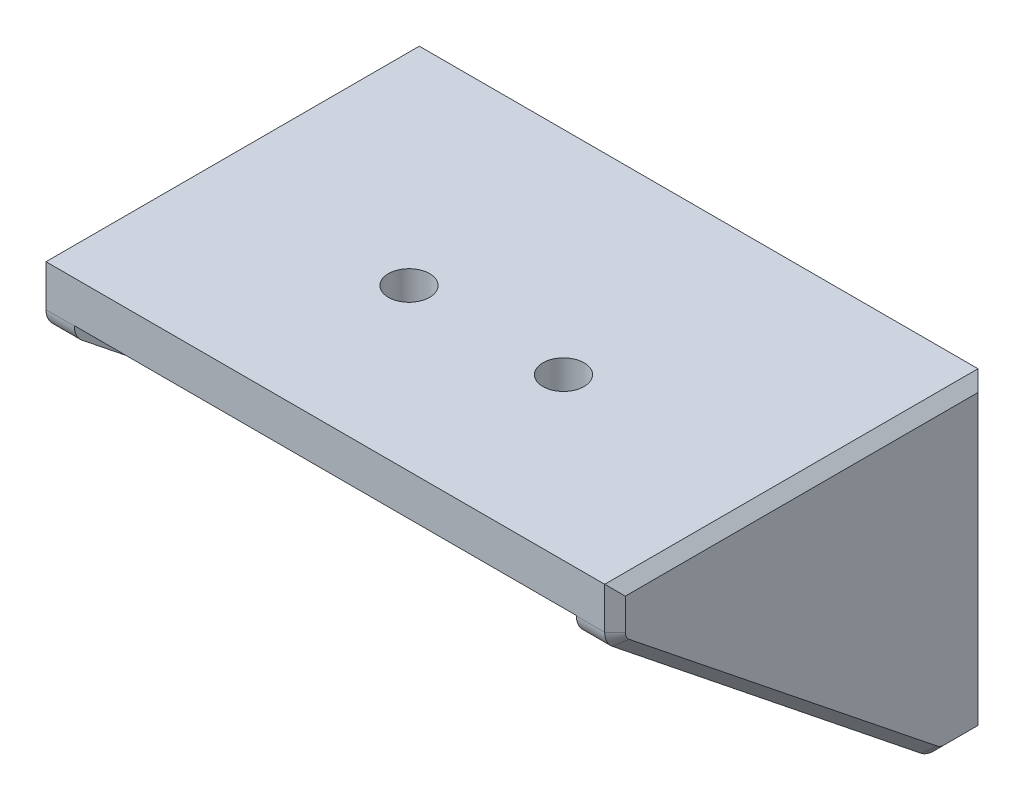
ISO-10303-21;
HEADER;
FILE_DESCRIPTION(('STEP AP214'),'2;1');
FILE_NAME('part.step','',(''),(''),'','','');
FILE_SCHEMA(('AUTOMOTIVE_DESIGN { 1 0 10303 214 1 1 1 1 }'));
ENDSEC;
DATA;
#1=APPLICATION_CONTEXT('core data for automotive mechanical design processes');
#2=APPLICATION_PROTOCOL_DEFINITION('international standard','automotive_design',2000,#1);
#3=PRODUCT_CONTEXT('',#1,'mechanical');
#4=PRODUCT('Part','Part','',(#3));
#5=PRODUCT_RELATED_PRODUCT_CATEGORY('part','',(#4));
#6=PRODUCT_DEFINITION_FORMATION('','',#4);
#7=PRODUCT_DEFINITION_CONTEXT('part definition',#1,'design');
#8=PRODUCT_DEFINITION('design','',#6,#7);
#9=PRODUCT_DEFINITION_SHAPE('','',#8);
#10=(LENGTH_UNIT() NAMED_UNIT(*) SI_UNIT(.MILLI.,.METRE.));
#11=(NAMED_UNIT(*) PLANE_ANGLE_UNIT() SI_UNIT($,.RADIAN.));
#12=(NAMED_UNIT(*) SI_UNIT($,.STERADIAN.) SOLID_ANGLE_UNIT());
#13=UNCERTAINTY_MEASURE_WITH_UNIT(LENGTH_MEASURE(1.E-05),#10,'distance_accuracy_value','');
#14=(GEOMETRIC_REPRESENTATION_CONTEXT(3) GLOBAL_UNCERTAINTY_ASSIGNED_CONTEXT((#13)) GLOBAL_UNIT_ASSIGNED_CONTEXT((#10,
#11,#12)) REPRESENTATION_CONTEXT('',''));
#15=CARTESIAN_POINT('',(0.,0.,0.));
#16=DIRECTION('',(0.,0.,1.));
#17=DIRECTION('',(1.,0.,0.));
#18=AXIS2_PLACEMENT_3D('',#15,#16,#17);
#19=CARTESIAN_POINT('',(0.,4.,0.));
#20=DIRECTION('',(0.,-1.,0.));
#21=DIRECTION('',(0.,0.,-1.));
#22=AXIS2_PLACEMENT_3D('',#19,#20,#21);
#23=PLANE('',#22);
#24=DIRECTION('',(-1.,0.,0.));
#25=VECTOR('',#24,1.);
#26=CARTESIAN_POINT('',(-19.5,4.,-14.5));
#27=LINE('',#26,#25);
#28=CARTESIAN_POINT('',(21.7,4.,-14.5));
#29=VERTEX_POINT('',#28);
#30=CARTESIAN_POINT('',(-21.7,4.,-14.5));
#31=VERTEX_POINT('',#30);
#32=EDGE_CURVE('E229',#29,#31,#27,.T.);
#33=ORIENTED_EDGE('',*,*,#32,.T.);
#34=DIRECTION('',(0.,0.,1.));
#35=VECTOR('',#34,1.);
#36=CARTESIAN_POINT('',(-21.7,4.,14.5));
#37=LINE('',#36,#35);
#38=CARTESIAN_POINT('',(-21.7,4.,14.5));
#39=VERTEX_POINT('',#38);
#40=EDGE_CURVE('E285',#31,#39,#37,.T.);
#41=ORIENTED_EDGE('',*,*,#40,.T.);
#42=DIRECTION('',(1.,0.,0.));
#43=VECTOR('',#42,1.);
#44=CARTESIAN_POINT('',(-19.5,4.,14.5));
#45=LINE('',#44,#43);
#46=CARTESIAN_POINT('',(21.7,4.,14.5));
#47=VERTEX_POINT('',#46);
#48=EDGE_CURVE('E257',#39,#47,#45,.T.);
#49=ORIENTED_EDGE('',*,*,#48,.T.);
#50=DIRECTION('',(0.,0.,-1.));
#51=VECTOR('',#50,1.);
#52=CARTESIAN_POINT('',(21.7,4.,-14.5));
#53=LINE('',#52,#51);
#54=EDGE_CURVE('E283',#47,#29,#53,.T.);
#55=ORIENTED_EDGE('',*,*,#54,.T.);
#56=EDGE_LOOP('',(#33,#41,#49,#55));
#57=FACE_BOUND('',#56,.T.);
#58=CARTESIAN_POINT('',(-6.,4.,2.));
#59=DIRECTION('',(0.,1.,0.));
#60=DIRECTION('',(0.,0.,1.));
#61=AXIS2_PLACEMENT_3D('',#58,#59,#60);
#62=CIRCLE('',#61,1.6);
#63=CARTESIAN_POINT('',(-6.,4.,3.6));
#64=VERTEX_POINT('',#63);
#65=EDGE_CURVE('E250',#64,#64,#62,.T.);
#66=ORIENTED_EDGE('',*,*,#65,.F.);
#67=EDGE_LOOP('',(#66));
#68=FACE_BOUND('',#67,.T.);
#69=CARTESIAN_POINT('',(6.,4.,2.));
#70=DIRECTION('',(0.,1.,0.));
#71=DIRECTION('',(0.,0.,-1.));
#72=AXIS2_PLACEMENT_3D('',#69,#70,#71);
#73=CIRCLE('',#72,1.6);
#74=CARTESIAN_POINT('',(6.,4.,0.400000000000002));
#75=VERTEX_POINT('',#74);
#76=EDGE_CURVE('E244',#75,#75,#73,.T.);
#77=ORIENTED_EDGE('',*,*,#76,.F.);
#78=EDGE_LOOP('',(#77));
#79=FACE_BOUND('',#78,.T.);
#80=ADVANCED_FACE('F37',(#57,#68,#79),#23,.F.);
#81=CARTESIAN_POINT('',(0.,0.,0.));
#82=DIRECTION('',(0.,-1.,0.));
#83=DIRECTION('',(0.,0.,-1.));
#84=AXIS2_PLACEMENT_3D('',#81,#82,#83);
#85=PLANE('',#84);
#86=DIRECTION('',(0.,0.,-1.));
#87=VECTOR('',#86,1.);
#88=CARTESIAN_POINT('',(19.5,0.,14.5));
#89=LINE('',#88,#87);
#90=CARTESIAN_POINT('',(19.5,0.,13.7));
#91=VERTEX_POINT('',#90);
#92=CARTESIAN_POINT('',(19.5,0.,-10.5));
#93=VERTEX_POINT('',#92);
#94=EDGE_CURVE('E230',#91,#93,#89,.T.);
#95=ORIENTED_EDGE('',*,*,#94,.F.);
#96=DIRECTION('',(-1.,0.,0.));
#97=VECTOR('',#96,1.);
#98=CARTESIAN_POINT('',(-19.5,0.,13.7));
#99=LINE('',#98,#97);
#100=CARTESIAN_POINT('',(-19.5,0.,13.7));
#101=VERTEX_POINT('',#100);
#102=EDGE_CURVE('E228',#91,#101,#99,.T.);
#103=ORIENTED_EDGE('',*,*,#102,.T.);
#104=DIRECTION('',(0.,0.,1.));
#105=VECTOR('',#104,1.);
#106=CARTESIAN_POINT('',(-19.5,0.,14.5));
#107=LINE('',#106,#105);
#108=CARTESIAN_POINT('',(-19.5,0.,-10.5));
#109=VERTEX_POINT('',#108);
#110=EDGE_CURVE('E212',#109,#101,#107,.T.);
#111=ORIENTED_EDGE('',*,*,#110,.F.);
#112=DIRECTION('',(-1.,0.,0.));
#113=VECTOR('',#112,1.);
#114=CARTESIAN_POINT('',(19.5,0.,-10.5));
#115=LINE('',#114,#113);
#116=EDGE_CURVE('E220',#93,#109,#115,.T.);
#117=ORIENTED_EDGE('',*,*,#116,.F.);
#118=EDGE_LOOP('',(#95,#103,#111,#117));
#119=FACE_BOUND('',#118,.T.);
#120=CARTESIAN_POINT('',(-6.,0.,2.));
#121=DIRECTION('',(0.,1.,0.));
#122=DIRECTION('',(0.,0.,1.));
#123=AXIS2_PLACEMENT_3D('',#120,#121,#122);
#124=CIRCLE('',#123,1.6);
#125=CARTESIAN_POINT('',(-6.,0.,3.6));
#126=VERTEX_POINT('',#125);
#127=EDGE_CURVE('E247',#126,#126,#124,.T.);
#128=ORIENTED_EDGE('',*,*,#127,.T.);
#129=EDGE_LOOP('',(#128));
#130=FACE_BOUND('',#129,.T.);
#131=CARTESIAN_POINT('',(6.,0.,2.));
#132=DIRECTION('',(0.,1.,0.));
#133=DIRECTION('',(0.,0.,-1.));
#134=AXIS2_PLACEMENT_3D('',#131,#132,#133);
#135=CIRCLE('',#134,1.6);
#136=CARTESIAN_POINT('',(6.,0.,0.400000000000002));
#137=VERTEX_POINT('',#136);
#138=EDGE_CURVE('E243',#137,#137,#135,.T.);
#139=ORIENTED_EDGE('',*,*,#138,.T.);
#140=EDGE_LOOP('',(#139));
#141=FACE_BOUND('',#140,.T.);
#142=ADVANCED_FACE('F225',(#119,#130,#141),#85,.T.);
#143=CARTESIAN_POINT('',(-19.5,4.,-14.5));
#144=DIRECTION('',(0.,0.,1.));
#145=DIRECTION('',(1.,0.,0.));
#146=AXIS2_PLACEMENT_3D('',#143,#144,#145);
#147=PLANE('',#146);
#148=CARTESIAN_POINT('',(-16.,-4.00000000000001,-14.5));
#149=DIRECTION('',(0.,0.,1.));
#150=DIRECTION('',(-1.,0.,0.));
#151=AXIS2_PLACEMENT_3D('',#148,#149,#150);
#152=CIRCLE('',#151,1.35);
#153=CARTESIAN_POINT('',(-17.35,-4.00000000000001,-14.5));
#154=VERTEX_POINT('',#153);
#155=EDGE_CURVE('E926',#154,#154,#152,.T.);
#156=ORIENTED_EDGE('',*,*,#155,.T.);
#157=EDGE_LOOP('',(#156));
#158=FACE_BOUND('',#157,.T.);
#159=CARTESIAN_POINT('',(-16.,-16.,-14.5));
#160=DIRECTION('',(0.,0.,1.));
#161=DIRECTION('',(1.,0.,0.));
#162=AXIS2_PLACEMENT_3D('',#159,#160,#161);
#163=CIRCLE('',#162,1.35);
#164=CARTESIAN_POINT('',(-14.65,-16.,-14.5));
#165=VERTEX_POINT('',#164);
#166=EDGE_CURVE('E915',#165,#165,#163,.T.);
#167=ORIENTED_EDGE('',*,*,#166,.T.);
#168=EDGE_LOOP('',(#167));
#169=FACE_BOUND('',#168,.T.);
#170=CARTESIAN_POINT('',(16.,-16.,-14.5));
#171=DIRECTION('',(0.,0.,1.));
#172=DIRECTION('',(-1.,0.,0.));
#173=AXIS2_PLACEMENT_3D('',#170,#171,#172);
#174=CIRCLE('',#173,1.35);
#175=CARTESIAN_POINT('',(14.65,-16.,-14.5));
#176=VERTEX_POINT('',#175);
#177=EDGE_CURVE('E908',#176,#176,#174,.T.);
#178=ORIENTED_EDGE('',*,*,#177,.T.);
#179=EDGE_LOOP('',(#178));
#180=FACE_BOUND('',#179,.T.);
#181=CARTESIAN_POINT('',(16.,-4.,-14.5));
#182=DIRECTION('',(0.,0.,1.));
#183=DIRECTION('',(1.,0.,0.));
#184=AXIS2_PLACEMENT_3D('',#181,#182,#183);
#185=CIRCLE('',#184,1.35);
#186=CARTESIAN_POINT('',(17.35,-4.,-14.5));
#187=VERTEX_POINT('',#186);
#188=EDGE_CURVE('E235',#187,#187,#185,.T.);
#189=ORIENTED_EDGE('',*,*,#188,.T.);
#190=EDGE_LOOP('',(#189));
#191=FACE_BOUND('',#190,.T.);
#192=DIRECTION('',(-1.,0.,0.));
#193=VECTOR('',#192,1.);
#194=CARTESIAN_POINT('',(-19.5,-19.2,-14.5));
#195=LINE('',#194,#193);
#196=CARTESIAN_POINT('',(21.7,-19.2,-14.5));
#197=VERTEX_POINT('',#196);
#198=CARTESIAN_POINT('',(-21.7,-19.2,-14.5));
#199=VERTEX_POINT('',#198);
#200=EDGE_CURVE('E295',#197,#199,#195,.T.);
#201=ORIENTED_EDGE('',*,*,#200,.T.);
#202=DIRECTION('',(0.,1.,0.));
#203=VECTOR('',#202,1.);
#204=CARTESIAN_POINT('',(-21.7,4.,-14.5));
#205=LINE('',#204,#203);
#206=EDGE_CURVE('E297',#199,#31,#205,.T.);
#207=ORIENTED_EDGE('',*,*,#206,.T.);
#208=ORIENTED_EDGE('',*,*,#32,.F.);
#209=DIRECTION('',(0.,-1.,0.));
#210=VECTOR('',#209,1.);
#211=CARTESIAN_POINT('',(21.7,-20.,-14.5));
#212=LINE('',#211,#210);
#213=EDGE_CURVE('E293',#29,#197,#212,.T.);
#214=ORIENTED_EDGE('',*,*,#213,.T.);
#215=EDGE_LOOP('',(#201,#207,#208,#214));
#216=FACE_BOUND('',#215,.T.);
#217=ADVANCED_FACE('F469',(#158,#169,#180,#191,#216),#147,.F.);
#218=CARTESIAN_POINT('',(-19.5,4.,14.5));
#219=DIRECTION('',(0.,0.,-1.));
#220=DIRECTION('',(-1.,0.,0.));
#221=AXIS2_PLACEMENT_3D('',#218,#219,#220);
#222=PLANE('',#221);
#223=DIRECTION('',(-1.,0.,0.));
#224=VECTOR('',#223,1.);
#225=CARTESIAN_POINT('',(-19.5,0.768999755978511,14.5));
#226=LINE('',#225,#224);
#227=CARTESIAN_POINT('',(19.5,0.768999755978511,14.5));
#228=VERTEX_POINT('',#227);
#229=CARTESIAN_POINT('',(21.7,0.768999755978511,14.5));
#230=VERTEX_POINT('',#229);
#231=EDGE_CURVE('E312',#228,#230,#226,.F.);
#232=ORIENTED_EDGE('',*,*,#231,.T.);
#233=DIRECTION('',(0.,1.,0.));
#234=VECTOR('',#233,1.);
#235=CARTESIAN_POINT('',(21.7,3.20000000000001,14.5));
#236=LINE('',#235,#234);
#237=EDGE_CURVE('E366',#230,#47,#236,.T.);
#238=ORIENTED_EDGE('',*,*,#237,.T.);
#239=ORIENTED_EDGE('',*,*,#48,.F.);
#240=DIRECTION('',(0.,-1.,0.));
#241=VECTOR('',#240,1.);
#242=CARTESIAN_POINT('',(-21.7,0.768999755978511,14.5));
#243=LINE('',#242,#241);
#244=CARTESIAN_POINT('',(-21.7,0.768999755978511,14.5));
#245=VERTEX_POINT('',#244);
#246=EDGE_CURVE('E364',#39,#245,#243,.T.);
#247=ORIENTED_EDGE('',*,*,#246,.T.);
#248=DIRECTION('',(1.,0.,0.));
#249=VECTOR('',#248,1.);
#250=CARTESIAN_POINT('',(-19.5,0.768999755978511,14.5));
#251=LINE('',#250,#249);
#252=CARTESIAN_POINT('',(-19.5,0.768999755978511,14.5));
#253=VERTEX_POINT('',#252);
#254=EDGE_CURVE('E329',#245,#253,#251,.T.);
#255=ORIENTED_EDGE('',*,*,#254,.T.);
#256=DIRECTION('',(0.,1.,0.));
#257=VECTOR('',#256,1.);
#258=CARTESIAN_POINT('',(-19.5,4.,14.5));
#259=LINE('',#258,#257);
#260=CARTESIAN_POINT('',(-19.5,0.799999999999995,14.5));
#261=VERTEX_POINT('',#260);
#262=EDGE_CURVE('E260',#253,#261,#259,.T.);
#263=ORIENTED_EDGE('',*,*,#262,.T.);
#264=DIRECTION('',(1.,0.,0.));
#265=VECTOR('',#264,1.);
#266=CARTESIAN_POINT('',(19.5,0.799999999999995,14.5));
#267=LINE('',#266,#265);
#268=CARTESIAN_POINT('',(19.5,0.799999999999995,14.5));
#269=VERTEX_POINT('',#268);
#270=EDGE_CURVE('E263',#261,#269,#267,.T.);
#271=ORIENTED_EDGE('',*,*,#270,.T.);
#272=DIRECTION('',(0.,-1.,0.));
#273=VECTOR('',#272,1.);
#274=CARTESIAN_POINT('',(19.5,4.,14.5));
#275=LINE('',#274,#273);
#276=EDGE_CURVE('E266',#269,#228,#275,.T.);
#277=ORIENTED_EDGE('',*,*,#276,.T.);
#278=EDGE_LOOP('',(#232,#238,#239,#247,#255,#263,#271,#277));
#279=FACE_BOUND('',#278,.T.);
#280=ADVANCED_FACE('F476',(#279),#222,.F.);
#281=CARTESIAN_POINT('',(-6.,4.,2.));
#282=DIRECTION('',(0.,-1.,0.));
#283=DIRECTION('',(0.,0.,-1.));
#284=AXIS2_PLACEMENT_3D('',#281,#282,#283);
#285=CYLINDRICAL_SURFACE('',#284,1.6);
#286=ORIENTED_EDGE('',*,*,#65,.T.);
#287=EDGE_LOOP('',(#286));
#288=FACE_BOUND('',#287,.T.);
#289=ORIENTED_EDGE('',*,*,#127,.F.);
#290=EDGE_LOOP('',(#289));
#291=FACE_BOUND('',#290,.T.);
#292=ADVANCED_FACE('F473',(#288,#291),#285,.F.);
#293=CARTESIAN_POINT('',(6.,4.,2.));
#294=DIRECTION('',(0.,-1.,0.));
#295=DIRECTION('',(0.,0.,-1.));
#296=AXIS2_PLACEMENT_3D('',#293,#294,#295);
#297=CYLINDRICAL_SURFACE('',#296,1.6);
#298=ORIENTED_EDGE('',*,*,#76,.T.);
#299=EDGE_LOOP('',(#298));
#300=FACE_BOUND('',#299,.T.);
#301=ORIENTED_EDGE('',*,*,#138,.F.);
#302=EDGE_LOOP('',(#301));
#303=FACE_BOUND('',#302,.T.);
#304=ADVANCED_FACE('F804',(#300,#303),#297,.F.);
#305=CARTESIAN_POINT('',(19.5,-20.,-10.5));
#306=DIRECTION('',(0.,0.,-1.));
#307=DIRECTION('',(-1.,0.,0.));
#308=AXIS2_PLACEMENT_3D('',#305,#306,#307);
#309=PLANE('',#308);
#310=CARTESIAN_POINT('',(-16.,-4.00000000000001,-10.5));
#311=DIRECTION('',(0.,0.,1.));
#312=DIRECTION('',(-1.,0.,0.));
#313=AXIS2_PLACEMENT_3D('',#310,#311,#312);
#314=CIRCLE('',#313,1.35);
#315=CARTESIAN_POINT('',(-17.35,-4.00000000000001,-10.5));
#316=VERTEX_POINT('',#315);
#317=EDGE_CURVE('E929',#316,#316,#314,.T.);
#318=ORIENTED_EDGE('',*,*,#317,.F.);
#319=EDGE_LOOP('',(#318));
#320=FACE_BOUND('',#319,.T.);
#321=CARTESIAN_POINT('',(-16.,-16.,-10.5));
#322=DIRECTION('',(0.,0.,1.));
#323=DIRECTION('',(1.,0.,0.));
#324=AXIS2_PLACEMENT_3D('',#321,#322,#323);
#325=CIRCLE('',#324,1.35);
#326=CARTESIAN_POINT('',(-14.65,-16.,-10.5));
#327=VERTEX_POINT('',#326);
#328=EDGE_CURVE('E923',#327,#327,#325,.T.);
#329=ORIENTED_EDGE('',*,*,#328,.F.);
#330=EDGE_LOOP('',(#329));
#331=FACE_BOUND('',#330,.T.);
#332=CARTESIAN_POINT('',(16.,-16.,-10.5));
#333=DIRECTION('',(0.,0.,1.));
#334=DIRECTION('',(-1.,0.,0.));
#335=AXIS2_PLACEMENT_3D('',#332,#333,#334);
#336=CIRCLE('',#335,1.35);
#337=CARTESIAN_POINT('',(14.65,-16.,-10.5));
#338=VERTEX_POINT('',#337);
#339=EDGE_CURVE('E910',#338,#338,#336,.T.);
#340=ORIENTED_EDGE('',*,*,#339,.F.);
#341=EDGE_LOOP('',(#340));
#342=FACE_BOUND('',#341,.T.);
#343=CARTESIAN_POINT('',(16.,-4.,-10.5));
#344=DIRECTION('',(0.,0.,1.));
#345=DIRECTION('',(1.,0.,0.));
#346=AXIS2_PLACEMENT_3D('',#343,#344,#345);
#347=CIRCLE('',#346,1.35);
#348=CARTESIAN_POINT('',(17.35,-4.,-10.5));
#349=VERTEX_POINT('',#348);
#350=EDGE_CURVE('E238',#349,#349,#347,.T.);
#351=ORIENTED_EDGE('',*,*,#350,.F.);
#352=EDGE_LOOP('',(#351));
#353=FACE_BOUND('',#352,.T.);
#354=DIRECTION('',(0.,1.,0.));
#355=VECTOR('',#354,1.);
#356=CARTESIAN_POINT('',(-19.5,-20.,-10.5));
#357=LINE('',#356,#355);
#358=CARTESIAN_POINT('',(-19.5,-19.2,-10.5));
#359=VERTEX_POINT('',#358);
#360=EDGE_CURVE('E207',#359,#109,#357,.T.);
#361=ORIENTED_EDGE('',*,*,#360,.F.);
#362=DIRECTION('',(1.,0.,0.));
#363=VECTOR('',#362,1.);
#364=CARTESIAN_POINT('',(19.5,-19.2,-10.5));
#365=LINE('',#364,#363);
#366=CARTESIAN_POINT('',(19.5,-19.2,-10.5));
#367=VERTEX_POINT('',#366);
#368=EDGE_CURVE('E281',#359,#367,#365,.T.);
#369=ORIENTED_EDGE('',*,*,#368,.T.);
#370=DIRECTION('',(0.,1.,0.));
#371=VECTOR('',#370,1.);
#372=CARTESIAN_POINT('',(19.5,-20.,-10.5));
#373=LINE('',#372,#371);
#374=EDGE_CURVE('E219',#367,#93,#373,.T.);
#375=ORIENTED_EDGE('',*,*,#374,.T.);
#376=ORIENTED_EDGE('',*,*,#116,.T.);
#377=EDGE_LOOP('',(#361,#369,#375,#376));
#378=FACE_BOUND('',#377,.T.);
#379=ADVANCED_FACE('F232',(#320,#331,#342,#353,#378),#309,.F.);
#380=CARTESIAN_POINT('',(0.,-20.,0.));
#381=DIRECTION('',(0.,1.,0.));
#382=DIRECTION('',(0.,0.,1.));
#383=AXIS2_PLACEMENT_3D('',#380,#381,#382);
#384=PLANE('',#383);
#385=DIRECTION('',(1.,0.,0.));
#386=VECTOR('',#385,1.);
#387=CARTESIAN_POINT('',(0.,-20.,-13.7));
#388=LINE('',#387,#386);
#389=CARTESIAN_POINT('',(-21.7,-20.,-13.7));
#390=VERTEX_POINT('',#389);
#391=CARTESIAN_POINT('',(21.7,-20.,-13.7));
#392=VERTEX_POINT('',#391);
#393=EDGE_CURVE('E270',#390,#392,#388,.T.);
#394=ORIENTED_EDGE('',*,*,#393,.T.);
#395=DIRECTION('',(0.,0.,1.));
#396=VECTOR('',#395,1.);
#397=CARTESIAN_POINT('',(21.7,-20.,-11.0612496949731));
#398=LINE('',#397,#396);
#399=CARTESIAN_POINT('',(21.7,-20.,-11.0612496949731));
#400=VERTEX_POINT('',#399);
#401=EDGE_CURVE('E379',#392,#400,#398,.T.);
#402=ORIENTED_EDGE('',*,*,#401,.T.);
#403=DIRECTION('',(-1.,0.,0.));
#404=VECTOR('',#403,1.);
#405=CARTESIAN_POINT('',(0.,-20.,-11.0612496949731));
#406=LINE('',#405,#404);
#407=CARTESIAN_POINT('',(19.5,-20.,-11.0612496949731));
#408=VERTEX_POINT('',#407);
#409=EDGE_CURVE('E339',#400,#408,#406,.T.);
#410=ORIENTED_EDGE('',*,*,#409,.T.);
#411=DIRECTION('',(0.,0.,-1.));
#412=VECTOR('',#411,1.);
#413=CARTESIAN_POINT('',(19.5,-20.,0.));
#414=LINE('',#413,#412);
#415=CARTESIAN_POINT('',(19.5,-20.,-11.3));
#416=VERTEX_POINT('',#415);
#417=EDGE_CURVE('E273',#408,#416,#414,.T.);
#418=ORIENTED_EDGE('',*,*,#417,.T.);
#419=DIRECTION('',(-1.,0.,0.));
#420=VECTOR('',#419,1.);
#421=CARTESIAN_POINT('',(0.,-20.,-11.3));
#422=LINE('',#421,#420);
#423=CARTESIAN_POINT('',(-19.5,-20.,-11.3));
#424=VERTEX_POINT('',#423);
#425=EDGE_CURVE('E275',#416,#424,#422,.T.);
#426=ORIENTED_EDGE('',*,*,#425,.T.);
#427=DIRECTION('',(0.,0.,1.));
#428=VECTOR('',#427,1.);
#429=CARTESIAN_POINT('',(-19.5,-20.,0.));
#430=LINE('',#429,#428);
#431=CARTESIAN_POINT('',(-19.5,-20.,-11.0612496949731));
#432=VERTEX_POINT('',#431);
#433=EDGE_CURVE('E278',#424,#432,#430,.T.);
#434=ORIENTED_EDGE('',*,*,#433,.T.);
#435=DIRECTION('',(1.,0.,0.));
#436=VECTOR('',#435,1.);
#437=CARTESIAN_POINT('',(-22.5,-20.,-11.0612496949731));
#438=LINE('',#437,#436);
#439=CARTESIAN_POINT('',(-21.7,-20.,-11.0612496949731));
#440=VERTEX_POINT('',#439);
#441=EDGE_CURVE('E341',#432,#440,#438,.F.);
#442=ORIENTED_EDGE('',*,*,#441,.T.);
#443=DIRECTION('',(0.,0.,-1.));
#444=VECTOR('',#443,1.);
#445=CARTESIAN_POINT('',(-21.7,-20.,-13.7));
#446=LINE('',#445,#444);
#447=EDGE_CURVE('E376',#440,#390,#446,.T.);
#448=ORIENTED_EDGE('',*,*,#447,.T.);
#449=EDGE_LOOP('',(#394,#402,#410,#418,#426,#434,#442,#448));
#450=FACE_BOUND('',#449,.T.);
#451=ADVANCED_FACE('F749',(#450),#384,.F.);
#452=CARTESIAN_POINT('',(16.,-4.,-14.5));
#453=DIRECTION('',(0.,0.,1.));
#454=DIRECTION('',(1.,0.,0.));
#455=AXIS2_PLACEMENT_3D('',#452,#453,#454);
#456=CYLINDRICAL_SURFACE('',#455,1.35);
#457=ORIENTED_EDGE('',*,*,#188,.F.);
#458=EDGE_LOOP('',(#457));
#459=FACE_BOUND('',#458,.T.);
#460=ORIENTED_EDGE('',*,*,#350,.T.);
#461=EDGE_LOOP('',(#460));
#462=FACE_BOUND('',#461,.T.);
#463=ADVANCED_FACE('F754',(#459,#462),#456,.F.);
#464=CARTESIAN_POINT('',(16.,-16.,-14.5));
#465=DIRECTION('',(0.,0.,1.));
#466=DIRECTION('',(1.,0.,0.));
#467=AXIS2_PLACEMENT_3D('',#464,#465,#466);
#468=CYLINDRICAL_SURFACE('',#467,1.35);
#469=ORIENTED_EDGE('',*,*,#177,.F.);
#470=EDGE_LOOP('',(#469));
#471=FACE_BOUND('',#470,.T.);
#472=ORIENTED_EDGE('',*,*,#339,.T.);
#473=EDGE_LOOP('',(#472));
#474=FACE_BOUND('',#473,.T.);
#475=ADVANCED_FACE('F840',(#471,#474),#468,.F.);
#476=CARTESIAN_POINT('',(-16.,-16.,-14.5));
#477=DIRECTION('',(0.,0.,1.));
#478=DIRECTION('',(1.,0.,0.));
#479=AXIS2_PLACEMENT_3D('',#476,#477,#478);
#480=CYLINDRICAL_SURFACE('',#479,1.35);
#481=ORIENTED_EDGE('',*,*,#166,.F.);
#482=EDGE_LOOP('',(#481));
#483=FACE_BOUND('',#482,.T.);
#484=ORIENTED_EDGE('',*,*,#328,.T.);
#485=EDGE_LOOP('',(#484));
#486=FACE_BOUND('',#485,.T.);
#487=ADVANCED_FACE('F830',(#483,#486),#480,.F.);
#488=CARTESIAN_POINT('',(-16.,-4.00000000000001,-14.5));
#489=DIRECTION('',(0.,0.,1.));
#490=DIRECTION('',(1.,0.,0.));
#491=AXIS2_PLACEMENT_3D('',#488,#489,#490);
#492=CYLINDRICAL_SURFACE('',#491,1.35);
#493=ORIENTED_EDGE('',*,*,#155,.F.);
#494=EDGE_LOOP('',(#493));
#495=FACE_BOUND('',#494,.T.);
#496=ORIENTED_EDGE('',*,*,#317,.T.);
#497=EDGE_LOOP('',(#496));
#498=FACE_BOUND('',#497,.T.);
#499=ADVANCED_FACE('F784',(#495,#498),#492,.F.);
#500=CARTESIAN_POINT('',(19.5,0.,0.));
#501=DIRECTION('',(1.,0.,0.));
#502=DIRECTION('',(0.,0.,-1.));
#503=AXIS2_PLACEMENT_3D('',#500,#501,#502);
#504=PLANE('',#503);
#505=DIRECTION('',(0.,-0.624695047554424,-0.78086880944303));
#506=VECTOR('',#505,1.);
#507=CARTESIAN_POINT('',(19.5,0.,14.5));
#508=LINE('',#507,#506);
#509=CARTESIAN_POINT('',(19.5,-0.480390339130338,13.8995120760871));
#510=VERTEX_POINT('',#509);
#511=CARTESIAN_POINT('',(19.5,-19.6493900951088,-10.0617376188861));
#512=VERTEX_POINT('',#511);
#513=EDGE_CURVE('E918',#510,#512,#508,.T.);
#514=ORIENTED_EDGE('',*,*,#513,.F.);
#515=CARTESIAN_POINT('',(19.5,0.768999755978511,12.9));
#516=DIRECTION('',(1.,0.,0.));
#517=DIRECTION('',(0.,0.,-1.));
#518=AXIS2_PLACEMENT_3D('',#515,#516,#517);
#519=CIRCLE('',#518,1.6);
#520=EDGE_CURVE('E351',#510,#228,#519,.F.);
#521=ORIENTED_EDGE('',*,*,#520,.T.);
#522=ORIENTED_EDGE('',*,*,#276,.F.);
#523=DIRECTION('',(0.,-0.707106781186544,-0.707106781186551));
#524=VECTOR('',#523,1.);
#525=CARTESIAN_POINT('',(19.5,-6.85,6.84999999999994));
#526=LINE('',#525,#524);
#527=EDGE_CURVE('E304',#269,#91,#526,.T.);
#528=ORIENTED_EDGE('',*,*,#527,.T.);
#529=ORIENTED_EDGE('',*,*,#94,.T.);
#530=ORIENTED_EDGE('',*,*,#374,.F.);
#531=DIRECTION('',(0.,0.707106781186549,0.707106781186546));
#532=VECTOR('',#531,1.);
#533=CARTESIAN_POINT('',(19.5,-4.34999999999995,4.34999999999997));
#534=LINE('',#533,#532);
#535=EDGE_CURVE('E309',#367,#416,#534,.F.);
#536=ORIENTED_EDGE('',*,*,#535,.T.);
#537=ORIENTED_EDGE('',*,*,#417,.F.);
#538=CARTESIAN_POINT('',(19.5,-18.4,-11.0612496949731));
#539=DIRECTION('',(1.,0.,0.));
#540=DIRECTION('',(0.,0.,-1.));
#541=AXIS2_PLACEMENT_3D('',#538,#539,#540);
#542=CIRCLE('',#541,1.6);
#543=EDGE_CURVE('E349',#408,#512,#542,.F.);
#544=ORIENTED_EDGE('',*,*,#543,.T.);
#545=EDGE_LOOP('',(#514,#521,#522,#528,#529,#530,#536,#537,#544));
#546=FACE_BOUND('',#545,.T.);
#547=ADVANCED_FACE('F741',(#546),#504,.F.);
#548=CARTESIAN_POINT('',(22.5,0.,14.5));
#549=DIRECTION('',(0.,0.78086880944303,-0.624695047554424));
#550=DIRECTION('',(0.,0.624695047554424,0.78086880944303));
#551=AXIS2_PLACEMENT_3D('',#548,#549,#550);
#552=PLANE('',#551);
#553=DIRECTION('',(-1.,0.,0.));
#554=VECTOR('',#553,1.);
#555=CARTESIAN_POINT('',(22.5,-19.6493900951088,-10.0617376188861));
#556=LINE('',#555,#554);
#557=CARTESIAN_POINT('',(21.7,-19.6493900951088,-10.0617376188861));
#558=VERTEX_POINT('',#557);
#559=EDGE_CURVE('E344',#512,#558,#556,.F.);
#560=ORIENTED_EDGE('',*,*,#559,.T.);
#561=DIRECTION('',(0.,0.624695047554424,0.78086880944303));
#562=VECTOR('',#561,1.);
#563=CARTESIAN_POINT('',(21.7,-0.480390339130338,13.8995120760871));
#564=LINE('',#563,#562);
#565=CARTESIAN_POINT('',(21.7,-0.480390339130338,13.8995120760871));
#566=VERTEX_POINT('',#565);
#567=EDGE_CURVE('E385',#558,#566,#564,.T.);
#568=ORIENTED_EDGE('',*,*,#567,.T.);
#569=DIRECTION('',(-1.,0.,0.));
#570=VECTOR('',#569,1.);
#571=CARTESIAN_POINT('',(22.5,-0.480390339130338,13.8995120760871));
#572=LINE('',#571,#570);
#573=EDGE_CURVE('E347',#566,#510,#572,.T.);
#574=ORIENTED_EDGE('',*,*,#573,.T.);
#575=ORIENTED_EDGE('',*,*,#513,.T.);
#576=EDGE_LOOP('',(#560,#568,#574,#575));
#577=FACE_BOUND('',#576,.T.);
#578=ADVANCED_FACE('F730',(#577),#552,.F.);
#579=CARTESIAN_POINT('',(22.5,0.,0.));
#580=DIRECTION('',(1.,0.,0.));
#581=DIRECTION('',(0.,0.,-1.));
#582=AXIS2_PLACEMENT_3D('',#579,#580,#581);
#583=PLANE('',#582);
#584=DIRECTION('',(0.,0.,1.));
#585=VECTOR('',#584,1.);
#586=CARTESIAN_POINT('',(22.5,3.20000000000001,14.5));
#587=LINE('',#586,#585);
#588=CARTESIAN_POINT('',(22.5,3.20000000000001,-13.7));
#589=VERTEX_POINT('',#588);
#590=CARTESIAN_POINT('',(22.5,3.20000000000001,13.7));
#591=VERTEX_POINT('',#590);
#592=EDGE_CURVE('E301',#589,#591,#587,.T.);
#593=ORIENTED_EDGE('',*,*,#592,.T.);
#594=DIRECTION('',(0.,-1.,0.));
#595=VECTOR('',#594,1.);
#596=CARTESIAN_POINT('',(22.5,0.768999755978511,13.7));
#597=LINE('',#596,#595);
#598=CARTESIAN_POINT('',(22.5,0.768999755978511,13.7));
#599=VERTEX_POINT('',#598);
#600=EDGE_CURVE('E361',#591,#599,#597,.T.);
#601=ORIENTED_EDGE('',*,*,#600,.T.);
#602=CARTESIAN_POINT('',(22.5,0.768999755978511,12.9));
#603=DIRECTION('',(1.,0.,0.));
#604=DIRECTION('',(0.,0.,-1.));
#605=AXIS2_PLACEMENT_3D('',#602,#603,#604);
#606=CIRCLE('',#605,0.799999999999997);
#607=CARTESIAN_POINT('',(22.5,0.144304708424092,13.3997560380435));
#608=VERTEX_POINT('',#607);
#609=EDGE_CURVE('E357',#599,#608,#606,.T.);
#610=ORIENTED_EDGE('',*,*,#609,.T.);
#611=DIRECTION('',(0.,-0.624695047554424,-0.78086880944303));
#612=VECTOR('',#611,1.);
#613=CARTESIAN_POINT('',(22.5,-19.0246950475544,-10.5614936569296));
#614=LINE('',#613,#612);
#615=CARTESIAN_POINT('',(22.5,-19.0246950475544,-10.5614936569296));
#616=VERTEX_POINT('',#615);
#617=EDGE_CURVE('E353',#608,#616,#614,.T.);
#618=ORIENTED_EDGE('',*,*,#617,.T.);
#619=CARTESIAN_POINT('',(22.5,-18.4,-11.0612496949731));
#620=DIRECTION('',(1.,0.,0.));
#621=DIRECTION('',(0.,0.,-1.));
#622=AXIS2_PLACEMENT_3D('',#619,#620,#621);
#623=CIRCLE('',#622,0.799999999999995);
#624=CARTESIAN_POINT('',(22.5,-19.2,-11.0612496949731));
#625=VERTEX_POINT('',#624);
#626=EDGE_CURVE('E355',#616,#625,#623,.T.);
#627=ORIENTED_EDGE('',*,*,#626,.T.);
#628=DIRECTION('',(0.,0.,-1.));
#629=VECTOR('',#628,1.);
#630=CARTESIAN_POINT('',(22.5,-19.2,-13.7));
#631=LINE('',#630,#629);
#632=CARTESIAN_POINT('',(22.5,-19.2,-13.7));
#633=VERTEX_POINT('',#632);
#634=EDGE_CURVE('E359',#625,#633,#631,.T.);
#635=ORIENTED_EDGE('',*,*,#634,.T.);
#636=DIRECTION('',(0.,1.,0.));
#637=VECTOR('',#636,1.);
#638=CARTESIAN_POINT('',(22.5,4.,-13.7));
#639=LINE('',#638,#637);
#640=EDGE_CURVE('E299',#633,#589,#639,.T.);
#641=ORIENTED_EDGE('',*,*,#640,.T.);
#642=EDGE_LOOP('',(#593,#601,#610,#618,#627,#635,#641));
#643=FACE_BOUND('',#642,.T.);
#644=ADVANCED_FACE('F725',(#643),#583,.T.);
#645=CARTESIAN_POINT('',(-19.5,0.,0.));
#646=DIRECTION('',(-1.,0.,0.));
#647=DIRECTION('',(0.,0.,-1.));
#648=AXIS2_PLACEMENT_3D('',#645,#646,#647);
#649=PLANE('',#648);
#650=ORIENTED_EDGE('',*,*,#262,.F.);
#651=CARTESIAN_POINT('',(-19.5,0.768999755978511,12.9));
#652=DIRECTION('',(-1.,0.,0.));
#653=DIRECTION('',(0.,0.,1.));
#654=AXIS2_PLACEMENT_3D('',#651,#652,#653);
#655=CIRCLE('',#654,1.6);
#656=CARTESIAN_POINT('',(-19.5,-0.480390339130338,13.8995120760871));
#657=VERTEX_POINT('',#656);
#658=EDGE_CURVE('E333',#253,#657,#655,.F.);
#659=ORIENTED_EDGE('',*,*,#658,.T.);
#660=DIRECTION('',(0.,-0.624695047554424,-0.78086880944303));
#661=VECTOR('',#660,1.);
#662=CARTESIAN_POINT('',(-19.5,0.,14.5));
#663=LINE('',#662,#661);
#664=CARTESIAN_POINT('',(-19.5,-19.6493900951088,-10.0617376188861));
#665=VERTEX_POINT('',#664);
#666=EDGE_CURVE('E326',#657,#665,#663,.T.);
#667=ORIENTED_EDGE('',*,*,#666,.T.);
#668=CARTESIAN_POINT('',(-19.5,-18.4,-11.0612496949731));
#669=DIRECTION('',(-1.,0.,0.));
#670=DIRECTION('',(0.,0.,1.));
#671=AXIS2_PLACEMENT_3D('',#668,#669,#670);
#672=CIRCLE('',#671,1.6);
#673=EDGE_CURVE('E331',#665,#432,#672,.F.);
#674=ORIENTED_EDGE('',*,*,#673,.T.);
#675=ORIENTED_EDGE('',*,*,#433,.F.);
#676=DIRECTION('',(0.,-0.707106781186549,-0.707106781186546));
#677=VECTOR('',#676,1.);
#678=CARTESIAN_POINT('',(-19.5,-4.34999999999995,4.34999999999997));
#679=LINE('',#678,#677);
#680=EDGE_CURVE('E215',#424,#359,#679,.F.);
#681=ORIENTED_EDGE('',*,*,#680,.T.);
#682=ORIENTED_EDGE('',*,*,#360,.T.);
#683=ORIENTED_EDGE('',*,*,#110,.T.);
#684=DIRECTION('',(0.,0.707106781186544,0.707106781186551));
#685=VECTOR('',#684,1.);
#686=CARTESIAN_POINT('',(-19.5,-6.85,6.84999999999994));
#687=LINE('',#686,#685);
#688=EDGE_CURVE('E306',#101,#261,#687,.T.);
#689=ORIENTED_EDGE('',*,*,#688,.T.);
#690=EDGE_LOOP('',(#650,#659,#667,#674,#675,#681,#682,#683,#689));
#691=FACE_BOUND('',#690,.T.);
#692=ADVANCED_FACE('F210',(#691),#649,.F.);
#693=CARTESIAN_POINT('',(-22.5,0.,14.5));
#694=DIRECTION('',(0.,-0.78086880944303,0.624695047554424));
#695=DIRECTION('',(0.,-0.624695047554424,-0.78086880944303));
#696=AXIS2_PLACEMENT_3D('',#693,#694,#695);
#697=PLANE('',#696);
#698=DIRECTION('',(1.,0.,0.));
#699=VECTOR('',#698,1.);
#700=CARTESIAN_POINT('',(-22.5,-0.480390339130338,13.8995120760871));
#701=LINE('',#700,#699);
#702=CARTESIAN_POINT('',(-21.7,-0.480390339130338,13.8995120760871));
#703=VERTEX_POINT('',#702);
#704=EDGE_CURVE('E337',#657,#703,#701,.F.);
#705=ORIENTED_EDGE('',*,*,#704,.T.);
#706=DIRECTION('',(0.,-0.624695047554424,-0.78086880944303));
#707=VECTOR('',#706,1.);
#708=CARTESIAN_POINT('',(-21.7,0.,14.5));
#709=LINE('',#708,#707);
#710=CARTESIAN_POINT('',(-21.7,-19.6493900951088,-10.0617376188861));
#711=VERTEX_POINT('',#710);
#712=EDGE_CURVE('E61',#703,#711,#709,.T.);
#713=ORIENTED_EDGE('',*,*,#712,.T.);
#714=DIRECTION('',(1.,0.,0.));
#715=VECTOR('',#714,1.);
#716=CARTESIAN_POINT('',(-19.5,-19.6493900951088,-10.0617376188861));
#717=LINE('',#716,#715);
#718=EDGE_CURVE('E335',#711,#665,#717,.T.);
#719=ORIENTED_EDGE('',*,*,#718,.T.);
#720=ORIENTED_EDGE('',*,*,#666,.F.);
#721=EDGE_LOOP('',(#705,#713,#719,#720));
#722=FACE_BOUND('',#721,.T.);
#723=ADVANCED_FACE('F709',(#722),#697,.T.);
#724=CARTESIAN_POINT('',(-22.5,0.,0.));
#725=DIRECTION('',(-1.,0.,0.));
#726=DIRECTION('',(0.,0.,-1.));
#727=AXIS2_PLACEMENT_3D('',#724,#725,#726);
#728=PLANE('',#727);
#729=DIRECTION('',(0.,-1.,0.));
#730=VECTOR('',#729,1.);
#731=CARTESIAN_POINT('',(-22.5,-20.,-13.7));
#732=LINE('',#731,#730);
#733=CARTESIAN_POINT('',(-22.5,3.20000000000001,-13.7));
#734=VERTEX_POINT('',#733);
#735=CARTESIAN_POINT('',(-22.5,-19.2,-13.7));
#736=VERTEX_POINT('',#735);
#737=EDGE_CURVE('E288',#734,#736,#732,.T.);
#738=ORIENTED_EDGE('',*,*,#737,.T.);
#739=DIRECTION('',(0.,0.,1.));
#740=VECTOR('',#739,1.);
#741=CARTESIAN_POINT('',(-22.5,-19.2,-11.0612496949731));
#742=LINE('',#741,#740);
#743=CARTESIAN_POINT('',(-22.5,-19.2,-11.0612496949731));
#744=VERTEX_POINT('',#743);
#745=EDGE_CURVE('E397',#736,#744,#742,.T.);
#746=ORIENTED_EDGE('',*,*,#745,.T.);
#747=CARTESIAN_POINT('',(-22.5,-18.4,-11.0612496949731));
#748=DIRECTION('',(-1.,0.,0.));
#749=DIRECTION('',(0.,0.,1.));
#750=AXIS2_PLACEMENT_3D('',#747,#748,#749);
#751=CIRCLE('',#750,0.799999999999985);
#752=CARTESIAN_POINT('',(-22.5,-19.0246950475544,-10.5614936569296));
#753=VERTEX_POINT('',#752);
#754=EDGE_CURVE('E395',#744,#753,#751,.T.);
#755=ORIENTED_EDGE('',*,*,#754,.T.);
#756=DIRECTION('',(0.,0.624695047554424,0.78086880944303));
#757=VECTOR('',#756,1.);
#758=CARTESIAN_POINT('',(-22.5,-6.44847568415288,5.1587805473223));
#759=LINE('',#758,#757);
#760=CARTESIAN_POINT('',(-22.5,0.144304708424099,13.3997560380435));
#761=VERTEX_POINT('',#760);
#762=EDGE_CURVE('E393',#753,#761,#759,.T.);
#763=ORIENTED_EDGE('',*,*,#762,.T.);
#764=CARTESIAN_POINT('',(-22.5,0.768999755978511,12.9));
#765=DIRECTION('',(-1.,0.,0.));
#766=DIRECTION('',(0.,0.,1.));
#767=AXIS2_PLACEMENT_3D('',#764,#765,#766);
#768=CIRCLE('',#767,0.799999999999983);
#769=CARTESIAN_POINT('',(-22.5,0.768999755978511,13.7));
#770=VERTEX_POINT('',#769);
#771=EDGE_CURVE('E391',#761,#770,#768,.T.);
#772=ORIENTED_EDGE('',*,*,#771,.T.);
#773=DIRECTION('',(0.,1.,0.));
#774=VECTOR('',#773,1.);
#775=CARTESIAN_POINT('',(-22.5,3.20000000000001,13.7));
#776=LINE('',#775,#774);
#777=CARTESIAN_POINT('',(-22.5,3.20000000000001,13.7));
#778=VERTEX_POINT('',#777);
#779=EDGE_CURVE('E389',#770,#778,#776,.T.);
#780=ORIENTED_EDGE('',*,*,#779,.T.);
#781=DIRECTION('',(0.,0.,-1.));
#782=VECTOR('',#781,1.);
#783=CARTESIAN_POINT('',(-22.5,3.20000000000001,-14.5));
#784=LINE('',#783,#782);
#785=EDGE_CURVE('E291',#778,#734,#784,.T.);
#786=ORIENTED_EDGE('',*,*,#785,.T.);
#787=EDGE_LOOP('',(#738,#746,#755,#763,#772,#780,#786));
#788=FACE_BOUND('',#787,.T.);
#789=ADVANCED_FACE('F434',(#788),#728,.T.);
#790=CARTESIAN_POINT('',(-19.5,0.799999999999995,14.5));
#791=DIRECTION('',(0.,-0.707106781186551,0.707106781186544));
#792=DIRECTION('',(-1.,0.,0.));
#793=AXIS2_PLACEMENT_3D('',#790,#791,#792);
#794=PLANE('',#793);
#795=ORIENTED_EDGE('',*,*,#688,.F.);
#796=ORIENTED_EDGE('',*,*,#102,.F.);
#797=ORIENTED_EDGE('',*,*,#527,.F.);
#798=ORIENTED_EDGE('',*,*,#270,.F.);
#799=EDGE_LOOP('',(#795,#796,#797,#798));
#800=FACE_BOUND('',#799,.T.);
#801=ADVANCED_FACE('F484',(#800),#794,.T.);
#802=CARTESIAN_POINT('',(0.,-20.,-11.3));
#803=DIRECTION('',(0.,0.707106781186546,-0.707106781186549));
#804=DIRECTION('',(-1.,0.,0.));
#805=AXIS2_PLACEMENT_3D('',#802,#803,#804);
#806=PLANE('',#805);
#807=ORIENTED_EDGE('',*,*,#535,.F.);
#808=ORIENTED_EDGE('',*,*,#368,.F.);
#809=ORIENTED_EDGE('',*,*,#680,.F.);
#810=ORIENTED_EDGE('',*,*,#425,.F.);
#811=EDGE_LOOP('',(#807,#808,#809,#810));
#812=FACE_BOUND('',#811,.T.);
#813=ADVANCED_FACE('F490',(#812),#806,.F.);
#814=CARTESIAN_POINT('',(22.5,3.20000000000001,0.));
#815=DIRECTION('',(0.707106781186544,0.707106781186551,0.));
#816=DIRECTION('',(0.,0.,-1.));
#817=AXIS2_PLACEMENT_3D('',#814,#815,#816);
#818=PLANE('',#817);
#819=ORIENTED_EDGE('',*,*,#54,.F.);
#820=DIRECTION('',(0.577350269189626,-0.577350269189621,-0.57735026918963));
#821=VECTOR('',#820,1.);
#822=CARTESIAN_POINT('',(27.0666666666667,-1.36666666666665,9.13333333333326));
#823=LINE('',#822,#821);
#824=EDGE_CURVE('E368',#47,#591,#823,.T.);
#825=ORIENTED_EDGE('',*,*,#824,.T.);
#826=ORIENTED_EDGE('',*,*,#592,.F.);
#827=DIRECTION('',(0.57735026918963,-0.577350269189625,0.577350269189622));
#828=VECTOR('',#827,1.);
#829=CARTESIAN_POINT('',(23.5666666666667,2.13333333333334,-12.6333333333333));
#830=LINE('',#829,#828);
#831=EDGE_CURVE('E323',#29,#589,#830,.T.);
#832=ORIENTED_EDGE('',*,*,#831,.F.);
#833=EDGE_LOOP('',(#819,#825,#826,#832));
#834=FACE_BOUND('',#833,.T.);
#835=ADVANCED_FACE('F497',(#834),#818,.T.);
#836=CARTESIAN_POINT('',(22.5,0.,-13.7));
#837=DIRECTION('',(0.707106781186543,0.,-0.707106781186552));
#838=DIRECTION('',(0.,-1.,0.));
#839=AXIS2_PLACEMENT_3D('',#836,#837,#838);
#840=PLANE('',#839);
#841=ORIENTED_EDGE('',*,*,#640,.F.);
#842=DIRECTION('',(-0.577350269189628,-0.577350269189628,-0.577350269189621));
#843=VECTOR('',#842,1.);
#844=CARTESIAN_POINT('',(28.9000000000001,-12.7999999999999,-7.30000000000004));
#845=LINE('',#844,#843);
#846=CARTESIAN_POINT('',(22.1,-19.6,-14.1));
#847=VERTEX_POINT('',#846);
#848=EDGE_CURVE('E370',#633,#847,#845,.T.);
#849=ORIENTED_EDGE('',*,*,#848,.T.);
#850=DIRECTION('',(0.577350269189629,-0.577350269189627,0.577350269189622));
#851=VECTOR('',#850,1.);
#852=CARTESIAN_POINT('',(15.8333333333333,-13.3333333333333,-20.3666666666666));
#853=LINE('',#852,#851);
#854=EDGE_CURVE('E320',#197,#847,#853,.T.);
#855=ORIENTED_EDGE('',*,*,#854,.F.);
#856=ORIENTED_EDGE('',*,*,#213,.F.);
#857=ORIENTED_EDGE('',*,*,#831,.T.);
#858=EDGE_LOOP('',(#841,#849,#855,#856,#857));
#859=FACE_BOUND('',#858,.T.);
#860=ADVANCED_FACE('F518',(#859),#840,.T.);
#861=CARTESIAN_POINT('',(0.,-20.,-13.7));
#862=DIRECTION('',(0.,0.707106781186544,0.707106781186551));
#863=DIRECTION('',(1.,0.,0.));
#864=AXIS2_PLACEMENT_3D('',#861,#862,#863);
#865=PLANE('',#864);
#866=ORIENTED_EDGE('',*,*,#854,.T.);
#867=DIRECTION('',(0.577350269189627,0.577350269189627,-0.577350269189622));
#868=VECTOR('',#867,1.);
#869=CARTESIAN_POINT('',(14.4666666666666,-27.2333333333334,-6.4666666666667));
#870=LINE('',#869,#868);
#871=EDGE_CURVE('E374',#847,#392,#870,.F.);
#872=ORIENTED_EDGE('',*,*,#871,.T.);
#873=ORIENTED_EDGE('',*,*,#393,.F.);
#874=DIRECTION('',(0.577350269189627,-0.577350269189627,0.577350269189622));
#875=VECTOR('',#874,1.);
#876=CARTESIAN_POINT('',(-14.4666666666666,-27.2333333333334,-6.4666666666667));
#877=LINE('',#876,#875);
#878=CARTESIAN_POINT('',(-22.1,-19.6,-14.1));
#879=VERTEX_POINT('',#878);
#880=EDGE_CURVE('E372',#390,#879,#877,.F.);
#881=ORIENTED_EDGE('',*,*,#880,.T.);
#882=DIRECTION('',(-0.577350269189627,-0.577350269189627,0.577350269189622));
#883=VECTOR('',#882,1.);
#884=CARTESIAN_POINT('',(-15.,-12.5,-21.2));
#885=LINE('',#884,#883);
#886=EDGE_CURVE('E316',#199,#879,#885,.T.);
#887=ORIENTED_EDGE('',*,*,#886,.F.);
#888=ORIENTED_EDGE('',*,*,#200,.F.);
#889=EDGE_LOOP('',(#866,#872,#873,#881,#887,#888));
#890=FACE_BOUND('',#889,.T.);
#891=ADVANCED_FACE('F512',(#890),#865,.F.);
#892=CARTESIAN_POINT('',(-21.7,4.,-14.5));
#893=DIRECTION('',(-0.707106781186544,0.,-0.707106781186551));
#894=DIRECTION('',(0.,-1.,0.));
#895=AXIS2_PLACEMENT_3D('',#892,#893,#894);
#896=PLANE('',#895);
#897=ORIENTED_EDGE('',*,*,#886,.T.);
#898=DIRECTION('',(-0.577350269189627,0.577350269189627,0.577350269189622));
#899=VECTOR('',#898,1.);
#900=CARTESIAN_POINT('',(-29.7,-11.9999999999999,-6.50000000000003));
#901=LINE('',#900,#899);
#902=EDGE_CURVE('E387',#879,#736,#901,.T.);
#903=ORIENTED_EDGE('',*,*,#902,.T.);
#904=ORIENTED_EDGE('',*,*,#737,.F.);
#905=DIRECTION('',(0.577350269189626,0.577350269189631,-0.577350269189621));
#906=VECTOR('',#905,1.);
#907=CARTESIAN_POINT('',(-21.7,4.,-14.5));
#908=LINE('',#907,#906);
#909=EDGE_CURVE('E313',#31,#734,#908,.F.);
#910=ORIENTED_EDGE('',*,*,#909,.F.);
#911=ORIENTED_EDGE('',*,*,#206,.F.);
#912=EDGE_LOOP('',(#897,#903,#904,#910,#911));
#913=FACE_BOUND('',#912,.T.);
#914=ADVANCED_FACE('F442',(#913),#896,.T.);
#915=CARTESIAN_POINT('',(-21.7,4.,0.));
#916=DIRECTION('',(-0.707106781186551,0.707106781186544,0.));
#917=DIRECTION('',(0.,0.,-1.));
#918=AXIS2_PLACEMENT_3D('',#915,#916,#917);
#919=PLANE('',#918);
#920=ORIENTED_EDGE('',*,*,#785,.F.);
#921=DIRECTION('',(0.577350269189624,0.577350269189629,0.577350269189624));
#922=VECTOR('',#921,1.);
#923=CARTESIAN_POINT('',(-26.5333333333333,-0.833333333333338,9.66666666666667));
#924=LINE('',#923,#922);
#925=EDGE_CURVE('E11',#778,#39,#924,.T.);
#926=ORIENTED_EDGE('',*,*,#925,.T.);
#927=ORIENTED_EDGE('',*,*,#40,.F.);
#928=ORIENTED_EDGE('',*,*,#909,.T.);
#929=EDGE_LOOP('',(#920,#926,#927,#928));
#930=FACE_BOUND('',#929,.T.);
#931=ADVANCED_FACE('F437',(#930),#919,.T.);
#932=CARTESIAN_POINT('',(-19.5,0.768999755978511,12.9));
#933=DIRECTION('',(-1.,0.,0.));
#934=DIRECTION('',(0.,0.,1.));
#935=AXIS2_PLACEMENT_3D('',#932,#933,#934);
#936=CYLINDRICAL_SURFACE('',#935,1.6);
#937=ORIENTED_EDGE('',*,*,#254,.F.);
#938=CARTESIAN_POINT('',(-21.7,0.768999755978511,12.9));
#939=DIRECTION('',(-1.,0.,0.));
#940=DIRECTION('',(0.,0.,1.));
#941=AXIS2_PLACEMENT_3D('',#938,#939,#940);
#942=CIRCLE('',#941,1.6);
#943=EDGE_CURVE('E47',#245,#703,#942,.F.);
#944=ORIENTED_EDGE('',*,*,#943,.T.);
#945=ORIENTED_EDGE('',*,*,#704,.F.);
#946=ORIENTED_EDGE('',*,*,#658,.F.);
#947=EDGE_LOOP('',(#937,#944,#945,#946));
#948=FACE_BOUND('',#947,.T.);
#949=ADVANCED_FACE('F506',(#948),#936,.T.);
#950=CARTESIAN_POINT('',(-22.5,-18.4,-11.0612496949731));
#951=DIRECTION('',(-1.,0.,0.));
#952=DIRECTION('',(0.,0.,1.));
#953=AXIS2_PLACEMENT_3D('',#950,#951,#952);
#954=CYLINDRICAL_SURFACE('',#953,1.6);
#955=ORIENTED_EDGE('',*,*,#718,.F.);
#956=CARTESIAN_POINT('',(-21.7,-18.4,-11.0612496949731));
#957=DIRECTION('',(-1.,0.,0.));
#958=DIRECTION('',(0.,0.,1.));
#959=AXIS2_PLACEMENT_3D('',#956,#957,#958);
#960=CIRCLE('',#959,1.6);
#961=EDGE_CURVE('E399',#711,#440,#960,.F.);
#962=ORIENTED_EDGE('',*,*,#961,.T.);
#963=ORIENTED_EDGE('',*,*,#441,.F.);
#964=ORIENTED_EDGE('',*,*,#673,.F.);
#965=EDGE_LOOP('',(#955,#962,#963,#964));
#966=FACE_BOUND('',#965,.T.);
#967=ADVANCED_FACE('F532',(#966),#954,.T.);
#968=CARTESIAN_POINT('',(22.5,0.768999755978511,12.9));
#969=DIRECTION('',(-1.,0.,0.));
#970=DIRECTION('',(0.,0.,1.));
#971=AXIS2_PLACEMENT_3D('',#968,#969,#970);
#972=CYLINDRICAL_SURFACE('',#971,1.6);
#973=ORIENTED_EDGE('',*,*,#573,.F.);
#974=CARTESIAN_POINT('',(21.7,0.768999755978511,12.9));
#975=DIRECTION('',(1.,0.,0.));
#976=DIRECTION('',(0.,0.,-1.));
#977=AXIS2_PLACEMENT_3D('',#974,#975,#976);
#978=CIRCLE('',#977,1.6);
#979=EDGE_CURVE('E381',#566,#230,#978,.F.);
#980=ORIENTED_EDGE('',*,*,#979,.T.);
#981=ORIENTED_EDGE('',*,*,#231,.F.);
#982=ORIENTED_EDGE('',*,*,#520,.F.);
#983=EDGE_LOOP('',(#973,#980,#981,#982));
#984=FACE_BOUND('',#983,.T.);
#985=ADVANCED_FACE('F535',(#984),#972,.T.);
#986=CARTESIAN_POINT('',(0.,-18.4,-11.0612496949731));
#987=DIRECTION('',(-1.,0.,0.));
#988=DIRECTION('',(0.,0.,1.));
#989=AXIS2_PLACEMENT_3D('',#986,#987,#988);
#990=CYLINDRICAL_SURFACE('',#989,1.6);
#991=ORIENTED_EDGE('',*,*,#409,.F.);
#992=CARTESIAN_POINT('',(21.7,-18.4,-11.0612496949731));
#993=DIRECTION('',(1.,0.,0.));
#994=DIRECTION('',(0.,0.,-1.));
#995=AXIS2_PLACEMENT_3D('',#992,#993,#994);
#996=CIRCLE('',#995,1.6);
#997=EDGE_CURVE('E383',#400,#558,#996,.F.);
#998=ORIENTED_EDGE('',*,*,#997,.T.);
#999=ORIENTED_EDGE('',*,*,#559,.F.);
#1000=ORIENTED_EDGE('',*,*,#543,.F.);
#1001=EDGE_LOOP('',(#991,#998,#999,#1000));
#1002=FACE_BOUND('',#1001,.T.);
#1003=ADVANCED_FACE('F539',(#1002),#990,.T.);
#1004=CARTESIAN_POINT('',(22.5,-19.2,0.));
#1005=DIRECTION('',(0.707106781186547,-0.707106781186547,0.));
#1006=DIRECTION('',(0.,0.,1.));
#1007=AXIS2_PLACEMENT_3D('',#1004,#1005,#1006);
#1008=PLANE('',#1007);
#1009=ORIENTED_EDGE('',*,*,#848,.F.);
#1010=ORIENTED_EDGE('',*,*,#634,.F.);
#1011=DIRECTION('',(0.707106781186547,0.707106781186547,0.));
#1012=VECTOR('',#1011,1.);
#1013=CARTESIAN_POINT('',(21.7,-20.,-11.0612496949731));
#1014=LINE('',#1013,#1012);
#1015=EDGE_CURVE('E317',#400,#625,#1014,.T.);
#1016=ORIENTED_EDGE('',*,*,#1015,.F.);
#1017=ORIENTED_EDGE('',*,*,#401,.F.);
#1018=ORIENTED_EDGE('',*,*,#871,.F.);
#1019=EDGE_LOOP('',(#1009,#1010,#1016,#1017,#1018));
#1020=FACE_BOUND('',#1019,.T.);
#1021=ADVANCED_FACE('F543',(#1020),#1008,.T.);
#1022=CARTESIAN_POINT('',(22.5,-18.4,-11.0612496949731));
#1023=DIRECTION('',(-1.,0.,0.));
#1024=DIRECTION('',(0.,0.,1.));
#1025=AXIS2_PLACEMENT_3D('',#1022,#1023,#1024);
#1026=CONICAL_SURFACE('',#1025,0.799999999999996,0.78539816339745);
#1027=ORIENTED_EDGE('',*,*,#1015,.T.);
#1028=ORIENTED_EDGE('',*,*,#626,.F.);
#1029=DIRECTION('',(0.707106781186547,0.552157630374233,-0.441726104299386));
#1030=VECTOR('',#1029,1.);
#1031=CARTESIAN_POINT('',(21.7,-19.6493900951088,-10.0617376188861));
#1032=LINE('',#1031,#1030);
#1033=EDGE_CURVE('E408',#558,#616,#1032,.T.);
#1034=ORIENTED_EDGE('',*,*,#1033,.F.);
#1035=ORIENTED_EDGE('',*,*,#997,.F.);
#1036=EDGE_LOOP('',(#1027,#1028,#1034,#1035));
#1037=FACE_BOUND('',#1036,.T.);
#1038=ADVANCED_FACE('F566',(#1037),#1026,.T.);
#1039=CARTESIAN_POINT('',(22.5,-6.44847568415289,5.15878054732231));
#1040=DIRECTION('',(0.707106781186548,-0.552157630374233,0.441726104299386));
#1041=DIRECTION('',(0.,0.624695047554424,0.78086880944303));
#1042=AXIS2_PLACEMENT_3D('',#1039,#1040,#1041);
#1043=PLANE('',#1042);
#1044=ORIENTED_EDGE('',*,*,#1033,.T.);
#1045=ORIENTED_EDGE('',*,*,#617,.F.);
#1046=DIRECTION('',(0.707106781186546,0.552157630374235,-0.441726104299387));
#1047=VECTOR('',#1046,1.);
#1048=CARTESIAN_POINT('',(21.7,-0.480390339130338,13.8995120760871));
#1049=LINE('',#1048,#1047);
#1050=EDGE_CURVE('E405',#566,#608,#1049,.T.);
#1051=ORIENTED_EDGE('',*,*,#1050,.F.);
#1052=ORIENTED_EDGE('',*,*,#567,.F.);
#1053=EDGE_LOOP('',(#1044,#1045,#1051,#1052));
#1054=FACE_BOUND('',#1053,.T.);
#1055=ADVANCED_FACE('F559',(#1054),#1043,.T.);
#1056=CARTESIAN_POINT('',(22.5,0.768999755978511,12.9));
#1057=DIRECTION('',(-1.,0.,0.));
#1058=DIRECTION('',(0.,0.,1.));
#1059=AXIS2_PLACEMENT_3D('',#1056,#1057,#1058);
#1060=CONICAL_SURFACE('',#1059,0.799999999999997,0.785398163397449);
#1061=ORIENTED_EDGE('',*,*,#1050,.T.);
#1062=ORIENTED_EDGE('',*,*,#609,.F.);
#1063=DIRECTION('',(0.707106781186547,0.,-0.707106781186548));
#1064=VECTOR('',#1063,1.);
#1065=CARTESIAN_POINT('',(21.7,0.768999755978511,14.5));
#1066=LINE('',#1065,#1064);
#1067=EDGE_CURVE('E403',#230,#599,#1066,.T.);
#1068=ORIENTED_EDGE('',*,*,#1067,.F.);
#1069=ORIENTED_EDGE('',*,*,#979,.F.);
#1070=EDGE_LOOP('',(#1061,#1062,#1068,#1069));
#1071=FACE_BOUND('',#1070,.T.);
#1072=ADVANCED_FACE('F552',(#1071),#1060,.T.);
#1073=CARTESIAN_POINT('',(22.5,0.,13.7));
#1074=DIRECTION('',(0.70710678118655,0.,0.707106781186545));
#1075=DIRECTION('',(0.,1.,0.));
#1076=AXIS2_PLACEMENT_3D('',#1073,#1074,#1075);
#1077=PLANE('',#1076);
#1078=ORIENTED_EDGE('',*,*,#824,.F.);
#1079=ORIENTED_EDGE('',*,*,#237,.F.);
#1080=ORIENTED_EDGE('',*,*,#1067,.T.);
#1081=ORIENTED_EDGE('',*,*,#600,.F.);
#1082=EDGE_LOOP('',(#1078,#1079,#1080,#1081));
#1083=FACE_BOUND('',#1082,.T.);
#1084=ADVANCED_FACE('F546',(#1083),#1077,.T.);
#1085=CARTESIAN_POINT('',(-21.7,4.,14.5));
#1086=DIRECTION('',(-0.707106781186548,0.,0.707106781186548));
#1087=DIRECTION('',(0.,1.,0.));
#1088=AXIS2_PLACEMENT_3D('',#1085,#1086,#1087);
#1089=PLANE('',#1088);
#1090=ORIENTED_EDGE('',*,*,#925,.F.);
#1091=ORIENTED_EDGE('',*,*,#779,.F.);
#1092=DIRECTION('',(-0.707106781186548,0.,-0.707106781186548));
#1093=VECTOR('',#1092,1.);
#1094=CARTESIAN_POINT('',(-21.7,0.768999755978511,14.5));
#1095=LINE('',#1094,#1093);
#1096=EDGE_CURVE('E42',#245,#770,#1095,.T.);
#1097=ORIENTED_EDGE('',*,*,#1096,.F.);
#1098=ORIENTED_EDGE('',*,*,#246,.F.);
#1099=EDGE_LOOP('',(#1090,#1091,#1097,#1098));
#1100=FACE_BOUND('',#1099,.T.);
#1101=ADVANCED_FACE('F40',(#1100),#1089,.T.);
#1102=CARTESIAN_POINT('',(-22.5,0.768999755978511,12.9));
#1103=DIRECTION('',(1.,0.,0.));
#1104=DIRECTION('',(0.,0.,-1.));
#1105=AXIS2_PLACEMENT_3D('',#1102,#1103,#1104);
#1106=CONICAL_SURFACE('',#1105,0.799999999999984,0.785398163397449);
#1107=ORIENTED_EDGE('',*,*,#1096,.T.);
#1108=ORIENTED_EDGE('',*,*,#771,.F.);
#1109=DIRECTION('',(-0.707106781186547,0.552157630374233,-0.441726104299386));
#1110=VECTOR('',#1109,1.);
#1111=CARTESIAN_POINT('',(-21.7,-0.480390339130338,13.8995120760871));
#1112=LINE('',#1111,#1110);
#1113=EDGE_CURVE('E418',#703,#761,#1112,.T.);
#1114=ORIENTED_EDGE('',*,*,#1113,.F.);
#1115=ORIENTED_EDGE('',*,*,#943,.F.);
#1116=EDGE_LOOP('',(#1107,#1108,#1114,#1115));
#1117=FACE_BOUND('',#1116,.T.);
#1118=ADVANCED_FACE('F427',(#1117),#1106,.T.);
#1119=CARTESIAN_POINT('',(-21.7,0.,14.5));
#1120=DIRECTION('',(0.707106781186548,0.552157630374233,-0.441726104299386));
#1121=DIRECTION('',(0.,-0.624695047554424,-0.78086880944303));
#1122=AXIS2_PLACEMENT_3D('',#1119,#1120,#1121);
#1123=PLANE('',#1122);
#1124=ORIENTED_EDGE('',*,*,#1113,.T.);
#1125=ORIENTED_EDGE('',*,*,#762,.F.);
#1126=DIRECTION('',(-0.707106781186547,0.552157630374233,-0.441726104299386));
#1127=VECTOR('',#1126,1.);
#1128=CARTESIAN_POINT('',(-21.7,-19.6493900951088,-10.0617376188861));
#1129=LINE('',#1128,#1127);
#1130=EDGE_CURVE('E416',#711,#753,#1129,.T.);
#1131=ORIENTED_EDGE('',*,*,#1130,.F.);
#1132=ORIENTED_EDGE('',*,*,#712,.F.);
#1133=EDGE_LOOP('',(#1124,#1125,#1131,#1132));
#1134=FACE_BOUND('',#1133,.T.);
#1135=ADVANCED_FACE('F454',(#1134),#1123,.F.);
#1136=CARTESIAN_POINT('',(-22.5,-18.4,-11.0612496949731));
#1137=DIRECTION('',(1.,0.,0.));
#1138=DIRECTION('',(0.,0.,-1.));
#1139=AXIS2_PLACEMENT_3D('',#1136,#1137,#1138);
#1140=CONICAL_SURFACE('',#1139,0.799999999999985,0.785398163397448);
#1141=ORIENTED_EDGE('',*,*,#1130,.T.);
#1142=ORIENTED_EDGE('',*,*,#754,.F.);
#1143=DIRECTION('',(-0.707106781186548,0.707106781186548,0.));
#1144=VECTOR('',#1143,1.);
#1145=CARTESIAN_POINT('',(-21.7,-20.,-11.0612496949731));
#1146=LINE('',#1145,#1144);
#1147=EDGE_CURVE('E413',#440,#744,#1146,.T.);
#1148=ORIENTED_EDGE('',*,*,#1147,.F.);
#1149=ORIENTED_EDGE('',*,*,#961,.F.);
#1150=EDGE_LOOP('',(#1141,#1142,#1148,#1149));
#1151=FACE_BOUND('',#1150,.T.);
#1152=ADVANCED_FACE('F452',(#1151),#1140,.T.);
#1153=CARTESIAN_POINT('',(-21.7,-20.,0.));
#1154=DIRECTION('',(-0.707106781186548,-0.707106781186548,0.));
#1155=DIRECTION('',(0.,0.,1.));
#1156=AXIS2_PLACEMENT_3D('',#1153,#1154,#1155);
#1157=PLANE('',#1156);
#1158=ORIENTED_EDGE('',*,*,#1147,.T.);
#1159=ORIENTED_EDGE('',*,*,#745,.F.);
#1160=ORIENTED_EDGE('',*,*,#902,.F.);
#1161=ORIENTED_EDGE('',*,*,#880,.F.);
#1162=ORIENTED_EDGE('',*,*,#447,.F.);
#1163=EDGE_LOOP('',(#1158,#1159,#1160,#1161,#1162));
#1164=FACE_BOUND('',#1163,.T.);
#1165=ADVANCED_FACE('F447',(#1164),#1157,.T.);
#1166=CLOSED_SHELL('',(#80,#142,#217,#280,#292,#304,#379,#451,#463,#475,#487,#499,#547,#578,
#644,#692,#723,#789,#801,#813,#835,#860,#891,#914,#931,#949,#967,#985,#1003,#1021,#1038,#1055,
#1072,#1084,#1101,#1118,#1135,#1152,#1165));
#1167=MANIFOLD_SOLID_BREP('B2',#1166);
#1168=ADVANCED_BREP_SHAPE_REPRESENTATION('',(#18,#1167),#14);
#1169=SHAPE_DEFINITION_REPRESENTATION(#9,#1168);
ENDSEC;
END-ISO-10303-21;
